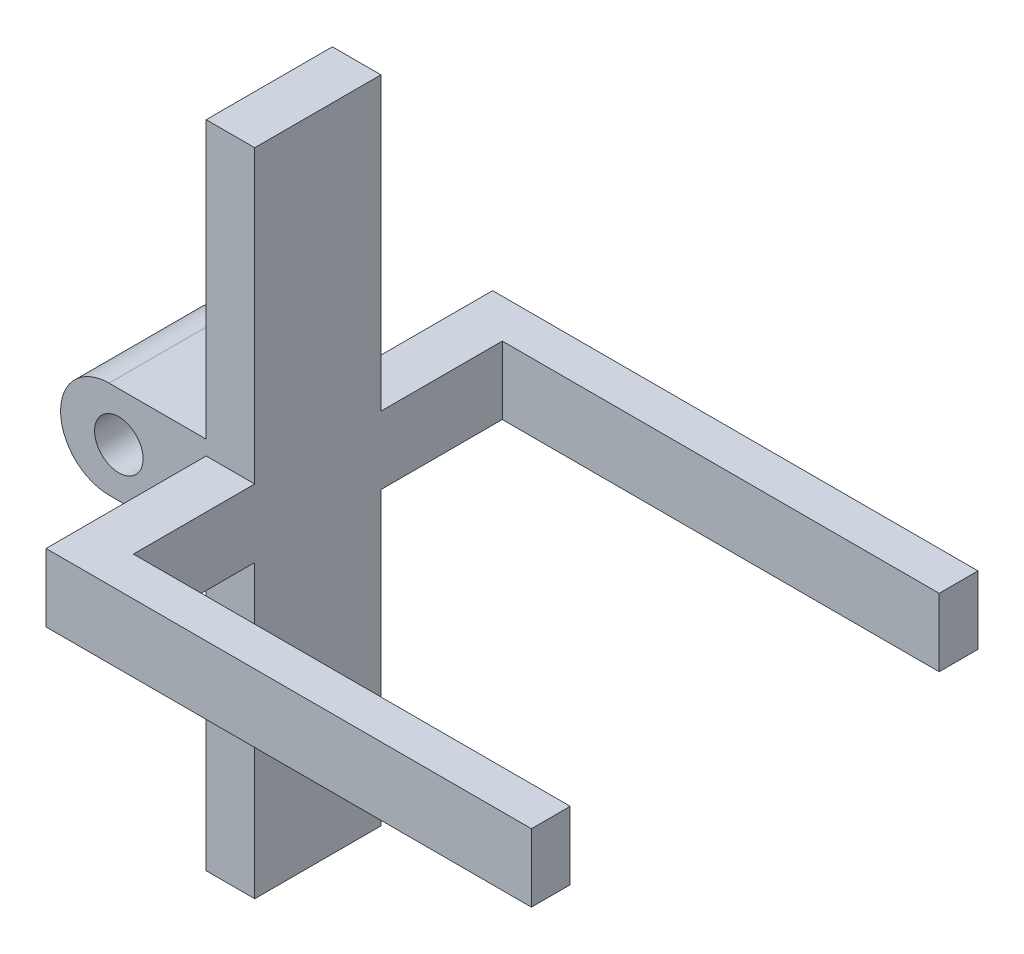
ISO-10303-21;
HEADER;
FILE_DESCRIPTION(('STEP AP214'),'2;1');
FILE_NAME('part.step','',(''),(''),'','','');
FILE_SCHEMA(('AUTOMOTIVE_DESIGN { 1 0 10303 214 1 1 1 1 }'));
ENDSEC;
DATA;
#1=APPLICATION_CONTEXT('core data for automotive mechanical design processes');
#2=APPLICATION_PROTOCOL_DEFINITION('international standard','automotive_design',2000,#1);
#3=PRODUCT_CONTEXT('',#1,'mechanical');
#4=PRODUCT('Part','Part','',(#3));
#5=PRODUCT_RELATED_PRODUCT_CATEGORY('part','',(#4));
#6=PRODUCT_DEFINITION_FORMATION('','',#4);
#7=PRODUCT_DEFINITION_CONTEXT('part definition',#1,'design');
#8=PRODUCT_DEFINITION('design','',#6,#7);
#9=PRODUCT_DEFINITION_SHAPE('','',#8);
#10=(LENGTH_UNIT() NAMED_UNIT(*) SI_UNIT(.MILLI.,.METRE.));
#11=(NAMED_UNIT(*) PLANE_ANGLE_UNIT() SI_UNIT($,.RADIAN.));
#12=(NAMED_UNIT(*) SI_UNIT($,.STERADIAN.) SOLID_ANGLE_UNIT());
#13=UNCERTAINTY_MEASURE_WITH_UNIT(LENGTH_MEASURE(1.E-05),#10,'distance_accuracy_value','');
#14=(GEOMETRIC_REPRESENTATION_CONTEXT(3) GLOBAL_UNCERTAINTY_ASSIGNED_CONTEXT((#13)) GLOBAL_UNIT_ASSIGNED_CONTEXT((#10,
#11,#12)) REPRESENTATION_CONTEXT('',''));
#15=CARTESIAN_POINT('',(0.,0.,0.));
#16=DIRECTION('',(0.,0.,1.));
#17=DIRECTION('',(1.,0.,0.));
#18=AXIS2_PLACEMENT_3D('',#15,#16,#17);
#19=CARTESIAN_POINT('',(12.5,-3.5,23.));
#20=DIRECTION('',(0.,1.,0.));
#21=DIRECTION('',(0.,0.,1.));
#22=AXIS2_PLACEMENT_3D('',#19,#20,#21);
#23=PLANE('',#22);
#24=DIRECTION('',(0.,0.,-1.));
#25=VECTOR('',#24,1.);
#26=CARTESIAN_POINT('',(12.5,-3.5,23.));
#27=LINE('',#26,#25);
#28=CARTESIAN_POINT('',(12.5,-3.5,-6.5));
#29=VERTEX_POINT('',#28);
#30=CARTESIAN_POINT('',(12.5,-3.5,-19.));
#31=VERTEX_POINT('',#30);
#32=EDGE_CURVE('E325',#29,#31,#27,.T.);
#33=ORIENTED_EDGE('',*,*,#32,.F.);
#34=DIRECTION('',(-1.,0.,0.));
#35=VECTOR('',#34,1.);
#36=CARTESIAN_POINT('',(7.5,-3.5,-6.5));
#37=LINE('',#36,#35);
#38=CARTESIAN_POINT('',(7.5,-3.5,-6.5));
#39=VERTEX_POINT('',#38);
#40=EDGE_CURVE('E223',#29,#39,#37,.T.);
#41=ORIENTED_EDGE('',*,*,#40,.T.);
#42=DIRECTION('',(0.,0.,-1.));
#43=VECTOR('',#42,1.);
#44=CARTESIAN_POINT('',(7.5,-3.5,23.));
#45=LINE('',#44,#43);
#46=CARTESIAN_POINT('',(7.5,-3.5,-23.));
#47=VERTEX_POINT('',#46);
#48=EDGE_CURVE('E341',#39,#47,#45,.T.);
#49=ORIENTED_EDGE('',*,*,#48,.T.);
#50=DIRECTION('',(-1.,0.,0.));
#51=VECTOR('',#50,1.);
#52=CARTESIAN_POINT('',(12.5,-3.5,-23.));
#53=LINE('',#52,#51);
#54=CARTESIAN_POINT('',(57.5,-3.5,-23.));
#55=VERTEX_POINT('',#54);
#56=EDGE_CURVE('E330',#55,#47,#53,.T.);
#57=ORIENTED_EDGE('',*,*,#56,.F.);
#58=DIRECTION('',(0.,0.,-1.));
#59=VECTOR('',#58,1.);
#60=CARTESIAN_POINT('',(57.5,-3.5,-23.));
#61=LINE('',#60,#59);
#62=CARTESIAN_POINT('',(57.5,-3.5,-19.));
#63=VERTEX_POINT('',#62);
#64=EDGE_CURVE('E277',#63,#55,#61,.T.);
#65=ORIENTED_EDGE('',*,*,#64,.F.);
#66=DIRECTION('',(-1.,0.,0.));
#67=VECTOR('',#66,1.);
#68=CARTESIAN_POINT('',(57.5,-3.5,-19.));
#69=LINE('',#68,#67);
#70=EDGE_CURVE('E273',#63,#31,#69,.T.);
#71=ORIENTED_EDGE('',*,*,#70,.T.);
#72=EDGE_LOOP('',(#33,#41,#49,#57,#65,#71));
#73=FACE_BOUND('',#72,.T.);
#74=ADVANCED_FACE('F43',(#73),#23,.F.);
#75=CARTESIAN_POINT('',(12.5,3.5,23.));
#76=DIRECTION('',(0.,-1.,0.));
#77=DIRECTION('',(0.,0.,-1.));
#78=AXIS2_PLACEMENT_3D('',#75,#76,#77);
#79=PLANE('',#78);
#80=DIRECTION('',(1.,0.,0.));
#81=VECTOR('',#80,1.);
#82=CARTESIAN_POINT('',(7.5,3.5,6.5));
#83=LINE('',#82,#81);
#84=CARTESIAN_POINT('',(7.5,3.5,6.5));
#85=VERTEX_POINT('',#84);
#86=CARTESIAN_POINT('',(12.5,3.5,6.5));
#87=VERTEX_POINT('',#86);
#88=EDGE_CURVE('E199',#85,#87,#83,.T.);
#89=ORIENTED_EDGE('',*,*,#88,.F.);
#90=DIRECTION('',(0.,0.,1.));
#91=VECTOR('',#90,1.);
#92=CARTESIAN_POINT('',(7.5,3.5,23.));
#93=LINE('',#92,#91);
#94=CARTESIAN_POINT('',(7.5,3.5,23.));
#95=VERTEX_POINT('',#94);
#96=EDGE_CURVE('E334',#85,#95,#93,.T.);
#97=ORIENTED_EDGE('',*,*,#96,.T.);
#98=DIRECTION('',(-1.,0.,0.));
#99=VECTOR('',#98,1.);
#100=CARTESIAN_POINT('',(12.5,3.5,23.));
#101=LINE('',#100,#99);
#102=CARTESIAN_POINT('',(57.5,3.5,23.));
#103=VERTEX_POINT('',#102);
#104=EDGE_CURVE('E353',#103,#95,#101,.T.);
#105=ORIENTED_EDGE('',*,*,#104,.F.);
#106=DIRECTION('',(0.,0.,1.));
#107=VECTOR('',#106,1.);
#108=CARTESIAN_POINT('',(57.5,3.5,23.));
#109=LINE('',#108,#107);
#110=CARTESIAN_POINT('',(57.5,3.5,19.));
#111=VERTEX_POINT('',#110);
#112=EDGE_CURVE('E306',#111,#103,#109,.T.);
#113=ORIENTED_EDGE('',*,*,#112,.F.);
#114=DIRECTION('',(-1.,0.,0.));
#115=VECTOR('',#114,1.);
#116=CARTESIAN_POINT('',(57.5,3.5,19.));
#117=LINE('',#116,#115);
#118=CARTESIAN_POINT('',(12.5,3.5,19.));
#119=VERTEX_POINT('',#118);
#120=EDGE_CURVE('E310',#111,#119,#117,.T.);
#121=ORIENTED_EDGE('',*,*,#120,.T.);
#122=DIRECTION('',(0.,0.,1.));
#123=VECTOR('',#122,1.);
#124=CARTESIAN_POINT('',(12.5,3.5,23.));
#125=LINE('',#124,#123);
#126=EDGE_CURVE('E68',#87,#119,#125,.T.);
#127=ORIENTED_EDGE('',*,*,#126,.F.);
#128=EDGE_LOOP('',(#89,#97,#105,#113,#121,#127));
#129=FACE_BOUND('',#128,.T.);
#130=ADVANCED_FACE('F469',(#129),#79,.F.);
#131=DIRECTION('',(-1.,0.,0.));
#132=VECTOR('',#131,1.);
#133=CARTESIAN_POINT('',(7.5,3.5,-6.5));
#134=LINE('',#133,#132);
#135=CARTESIAN_POINT('',(12.5,3.5,-6.5));
#136=VERTEX_POINT('',#135);
#137=CARTESIAN_POINT('',(7.5,3.5,-6.5));
#138=VERTEX_POINT('',#137);
#139=EDGE_CURVE('E239',#136,#138,#134,.T.);
#140=ORIENTED_EDGE('',*,*,#139,.F.);
#141=CARTESIAN_POINT('',(12.5,3.5,-19.));
#142=VERTEX_POINT('',#141);
#143=EDGE_CURVE('E321',#142,#136,#125,.T.);
#144=ORIENTED_EDGE('',*,*,#143,.F.);
#145=DIRECTION('',(-1.,0.,0.));
#146=VECTOR('',#145,1.);
#147=CARTESIAN_POINT('',(57.5,3.5,-19.));
#148=LINE('',#147,#146);
#149=CARTESIAN_POINT('',(57.5,3.5,-19.));
#150=VERTEX_POINT('',#149);
#151=EDGE_CURVE('E269',#150,#142,#148,.T.);
#152=ORIENTED_EDGE('',*,*,#151,.F.);
#153=DIRECTION('',(0.,0.,1.));
#154=VECTOR('',#153,1.);
#155=CARTESIAN_POINT('',(57.5,3.5,-23.));
#156=LINE('',#155,#154);
#157=CARTESIAN_POINT('',(57.5,3.5,-23.));
#158=VERTEX_POINT('',#157);
#159=EDGE_CURVE('E290',#158,#150,#156,.T.);
#160=ORIENTED_EDGE('',*,*,#159,.F.);
#161=DIRECTION('',(-1.,0.,0.));
#162=VECTOR('',#161,1.);
#163=CARTESIAN_POINT('',(12.5,3.5,-23.));
#164=LINE('',#163,#162);
#165=CARTESIAN_POINT('',(7.5,3.5,-23.));
#166=VERTEX_POINT('',#165);
#167=EDGE_CURVE('E357',#158,#166,#164,.T.);
#168=ORIENTED_EDGE('',*,*,#167,.T.);
#169=EDGE_CURVE('E335',#166,#138,#93,.T.);
#170=ORIENTED_EDGE('',*,*,#169,.T.);
#171=EDGE_LOOP('',(#140,#144,#152,#160,#168,#170));
#172=FACE_BOUND('',#171,.T.);
#173=ADVANCED_FACE('F445',(#172),#79,.F.);
#174=CARTESIAN_POINT('',(12.5,0.,0.));
#175=DIRECTION('',(-1.,0.,0.));
#176=DIRECTION('',(0.,0.,1.));
#177=AXIS2_PLACEMENT_3D('',#174,#175,#176);
#178=PLANE('',#177);
#179=DIRECTION('',(0.,-1.,0.));
#180=VECTOR('',#179,1.);
#181=CARTESIAN_POINT('',(12.5,3.5,-19.));
#182=LINE('',#181,#180);
#183=EDGE_CURVE('E278',#142,#31,#182,.T.);
#184=ORIENTED_EDGE('',*,*,#183,.F.);
#185=ORIENTED_EDGE('',*,*,#143,.T.);
#186=DIRECTION('',(0.,-1.,0.));
#187=VECTOR('',#186,1.);
#188=CARTESIAN_POINT('',(12.5,33.5,-6.5));
#189=LINE('',#188,#187);
#190=CARTESIAN_POINT('',(12.5,33.5,-6.5));
#191=VERTEX_POINT('',#190);
#192=EDGE_CURVE('E257',#191,#136,#189,.T.);
#193=ORIENTED_EDGE('',*,*,#192,.F.);
#194=DIRECTION('',(0.,0.,-1.));
#195=VECTOR('',#194,1.);
#196=CARTESIAN_POINT('',(12.5,33.5,-6.5));
#197=LINE('',#196,#195);
#198=CARTESIAN_POINT('',(12.5,33.5,6.5));
#199=VERTEX_POINT('',#198);
#200=EDGE_CURVE('E242',#199,#191,#197,.T.);
#201=ORIENTED_EDGE('',*,*,#200,.F.);
#202=DIRECTION('',(0.,-1.,0.));
#203=VECTOR('',#202,1.);
#204=CARTESIAN_POINT('',(12.5,33.5,6.5));
#205=LINE('',#204,#203);
#206=EDGE_CURVE('E261',#199,#87,#205,.T.);
#207=ORIENTED_EDGE('',*,*,#206,.T.);
#208=ORIENTED_EDGE('',*,*,#126,.T.);
#209=DIRECTION('',(0.,1.,0.));
#210=VECTOR('',#209,1.);
#211=CARTESIAN_POINT('',(12.5,3.5,19.));
#212=LINE('',#211,#210);
#213=CARTESIAN_POINT('',(12.5,-3.5,19.));
#214=VERTEX_POINT('',#213);
#215=EDGE_CURVE('E282',#214,#119,#212,.T.);
#216=ORIENTED_EDGE('',*,*,#215,.F.);
#217=CARTESIAN_POINT('',(12.5,-3.5,6.5));
#218=VERTEX_POINT('',#217);
#219=EDGE_CURVE('E326',#214,#218,#27,.T.);
#220=ORIENTED_EDGE('',*,*,#219,.T.);
#221=DIRECTION('',(0.,1.,0.));
#222=VECTOR('',#221,1.);
#223=CARTESIAN_POINT('',(12.5,-33.5,6.5));
#224=LINE('',#223,#222);
#225=CARTESIAN_POINT('',(12.5,-33.5,6.5));
#226=VERTEX_POINT('',#225);
#227=EDGE_CURVE('E60',#226,#218,#224,.T.);
#228=ORIENTED_EDGE('',*,*,#227,.F.);
#229=DIRECTION('',(0.,0.,-1.));
#230=VECTOR('',#229,1.);
#231=CARTESIAN_POINT('',(12.5,-33.5,-6.5));
#232=LINE('',#231,#230);
#233=CARTESIAN_POINT('',(12.5,-33.5,-6.5));
#234=VERTEX_POINT('',#233);
#235=EDGE_CURVE('E215',#226,#234,#232,.T.);
#236=ORIENTED_EDGE('',*,*,#235,.T.);
#237=DIRECTION('',(0.,1.,0.));
#238=VECTOR('',#237,1.);
#239=CARTESIAN_POINT('',(12.5,-33.5,-6.5));
#240=LINE('',#239,#238);
#241=EDGE_CURVE('E200',#234,#29,#240,.T.);
#242=ORIENTED_EDGE('',*,*,#241,.T.);
#243=ORIENTED_EDGE('',*,*,#32,.T.);
#244=EDGE_LOOP('',(#184,#185,#193,#201,#207,#208,#216,#220,#228,#236,#242,#243));
#245=FACE_BOUND('',#244,.T.);
#246=ADVANCED_FACE('F441',(#245),#178,.F.);
#247=CARTESIAN_POINT('',(7.5,-5.,-6.5));
#248=DIRECTION('',(0.,0.,1.));
#249=DIRECTION('',(1.,0.,0.));
#250=AXIS2_PLACEMENT_3D('',#247,#248,#249);
#251=PLANE('',#250);
#252=CARTESIAN_POINT('',(-1.5,0.,-6.5));
#253=DIRECTION('',(0.,0.,1.));
#254=DIRECTION('',(1.,0.,0.));
#255=AXIS2_PLACEMENT_3D('',#252,#253,#254);
#256=CIRCLE('',#255,2.5);
#257=CARTESIAN_POINT('',(1.,0.,-6.5));
#258=VERTEX_POINT('',#257);
#259=EDGE_CURVE('E365',#258,#258,#256,.T.);
#260=ORIENTED_EDGE('',*,*,#259,.T.);
#261=EDGE_LOOP('',(#260));
#262=FACE_BOUND('',#261,.T.);
#263=DIRECTION('',(-1.,0.,0.));
#264=VECTOR('',#263,1.);
#265=CARTESIAN_POINT('',(7.5,-5.,-6.5));
#266=LINE('',#265,#264);
#267=CARTESIAN_POINT('',(7.5,-5.,-6.5));
#268=VERTEX_POINT('',#267);
#269=CARTESIAN_POINT('',(-2.5,-5.,-6.5));
#270=VERTEX_POINT('',#269);
#271=EDGE_CURVE('E383',#268,#270,#266,.T.);
#272=ORIENTED_EDGE('',*,*,#271,.T.);
#273=CARTESIAN_POINT('',(-2.5,0.,-6.5));
#274=DIRECTION('',(0.,0.,1.));
#275=DIRECTION('',(1.,0.,0.));
#276=AXIS2_PLACEMENT_3D('',#273,#274,#275);
#277=CIRCLE('',#276,5.);
#278=CARTESIAN_POINT('',(-7.5,0.,-6.5));
#279=VERTEX_POINT('',#278);
#280=EDGE_CURVE('E405',#270,#279,#277,.F.);
#281=ORIENTED_EDGE('',*,*,#280,.T.);
#282=CARTESIAN_POINT('',(-2.5,0.,-6.5));
#283=DIRECTION('',(0.,0.,1.));
#284=DIRECTION('',(1.,0.,0.));
#285=AXIS2_PLACEMENT_3D('',#282,#283,#284);
#286=CIRCLE('',#285,5.);
#287=CARTESIAN_POINT('',(-2.5,5.,-6.5));
#288=VERTEX_POINT('',#287);
#289=EDGE_CURVE('E402',#279,#288,#286,.F.);
#290=ORIENTED_EDGE('',*,*,#289,.T.);
#291=DIRECTION('',(-1.,0.,0.));
#292=VECTOR('',#291,1.);
#293=CARTESIAN_POINT('',(7.5,5.,-6.5));
#294=LINE('',#293,#292);
#295=CARTESIAN_POINT('',(7.5,5.,-6.5));
#296=VERTEX_POINT('',#295);
#297=EDGE_CURVE('E394',#296,#288,#294,.T.);
#298=ORIENTED_EDGE('',*,*,#297,.F.);
#299=DIRECTION('',(0.,-1.,0.));
#300=VECTOR('',#299,1.);
#301=CARTESIAN_POINT('',(7.5,33.5,-6.5));
#302=LINE('',#301,#300);
#303=CARTESIAN_POINT('',(7.5,33.5,-6.5));
#304=VERTEX_POINT('',#303);
#305=EDGE_CURVE('E248',#304,#296,#302,.T.);
#306=ORIENTED_EDGE('',*,*,#305,.F.);
#307=DIRECTION('',(-1.,0.,0.));
#308=VECTOR('',#307,1.);
#309=CARTESIAN_POINT('',(7.5,33.5,-6.5));
#310=LINE('',#309,#308);
#311=EDGE_CURVE('E245',#191,#304,#310,.T.);
#312=ORIENTED_EDGE('',*,*,#311,.F.);
#313=ORIENTED_EDGE('',*,*,#192,.T.);
#314=ORIENTED_EDGE('',*,*,#139,.T.);
#315=DIRECTION('',(0.,1.,0.));
#316=VECTOR('',#315,1.);
#317=CARTESIAN_POINT('',(7.5,-5.,-6.5));
#318=LINE('',#317,#316);
#319=EDGE_CURVE('E369',#39,#138,#318,.T.);
#320=ORIENTED_EDGE('',*,*,#319,.F.);
#321=ORIENTED_EDGE('',*,*,#40,.F.);
#322=ORIENTED_EDGE('',*,*,#241,.F.);
#323=DIRECTION('',(-1.,0.,0.));
#324=VECTOR('',#323,1.);
#325=CARTESIAN_POINT('',(7.5,-33.5,-6.5));
#326=LINE('',#325,#324);
#327=CARTESIAN_POINT('',(7.5,-33.5,-6.5));
#328=VERTEX_POINT('',#327);
#329=EDGE_CURVE('E206',#234,#328,#326,.T.);
#330=ORIENTED_EDGE('',*,*,#329,.T.);
#331=DIRECTION('',(0.,1.,0.));
#332=VECTOR('',#331,1.);
#333=CARTESIAN_POINT('',(7.5,-33.5,-6.5));
#334=LINE('',#333,#332);
#335=EDGE_CURVE('E187',#328,#268,#334,.T.);
#336=ORIENTED_EDGE('',*,*,#335,.T.);
#337=EDGE_LOOP('',(#272,#281,#290,#298,#306,#312,#313,#314,#320,#321,#322,#330,#336));
#338=FACE_BOUND('',#337,.T.);
#339=ADVANCED_FACE('F212',(#262,#338),#251,.F.);
#340=CARTESIAN_POINT('',(7.5,5.,6.5));
#341=DIRECTION('',(0.,-1.,0.));
#342=DIRECTION('',(0.,0.,-1.));
#343=AXIS2_PLACEMENT_3D('',#340,#341,#342);
#344=PLANE('',#343);
#345=ORIENTED_EDGE('',*,*,#297,.T.);
#346=DIRECTION('',(0.,0.,1.));
#347=VECTOR('',#346,1.);
#348=CARTESIAN_POINT('',(-2.5,5.,6.5));
#349=LINE('',#348,#347);
#350=CARTESIAN_POINT('',(-2.5,5.,6.5));
#351=VERTEX_POINT('',#350);
#352=EDGE_CURVE('E11',#288,#351,#349,.T.);
#353=ORIENTED_EDGE('',*,*,#352,.T.);
#354=DIRECTION('',(-1.,0.,0.));
#355=VECTOR('',#354,1.);
#356=CARTESIAN_POINT('',(7.5,5.,6.5));
#357=LINE('',#356,#355);
#358=CARTESIAN_POINT('',(7.5,5.,6.5));
#359=VERTEX_POINT('',#358);
#360=EDGE_CURVE('E390',#359,#351,#357,.T.);
#361=ORIENTED_EDGE('',*,*,#360,.F.);
#362=DIRECTION('',(0.,0.,1.));
#363=VECTOR('',#362,1.);
#364=CARTESIAN_POINT('',(7.5,5.,6.5));
#365=LINE('',#364,#363);
#366=EDGE_CURVE('E373',#296,#359,#365,.T.);
#367=ORIENTED_EDGE('',*,*,#366,.F.);
#368=EDGE_LOOP('',(#345,#353,#361,#367));
#369=FACE_BOUND('',#368,.T.);
#370=ADVANCED_FACE('F428',(#369),#344,.F.);
#371=CARTESIAN_POINT('',(7.5,-5.,6.5));
#372=DIRECTION('',(0.,0.,-1.));
#373=DIRECTION('',(-1.,0.,0.));
#374=AXIS2_PLACEMENT_3D('',#371,#372,#373);
#375=PLANE('',#374);
#376=CARTESIAN_POINT('',(-1.5,0.,6.5));
#377=DIRECTION('',(0.,0.,1.));
#378=DIRECTION('',(1.,0.,0.));
#379=AXIS2_PLACEMENT_3D('',#376,#377,#378);
#380=CIRCLE('',#379,2.5);
#381=CARTESIAN_POINT('',(1.,0.,6.5));
#382=VERTEX_POINT('',#381);
#383=EDGE_CURVE('E361',#382,#382,#380,.T.);
#384=ORIENTED_EDGE('',*,*,#383,.F.);
#385=EDGE_LOOP('',(#384));
#386=FACE_BOUND('',#385,.T.);
#387=CARTESIAN_POINT('',(-2.5,0.,6.5));
#388=DIRECTION('',(0.,0.,-1.));
#389=DIRECTION('',(-1.,0.,0.));
#390=AXIS2_PLACEMENT_3D('',#387,#388,#389);
#391=CIRCLE('',#390,5.);
#392=CARTESIAN_POINT('',(-7.5,0.,6.5));
#393=VERTEX_POINT('',#392);
#394=EDGE_CURVE('E408',#351,#393,#391,.F.);
#395=ORIENTED_EDGE('',*,*,#394,.T.);
#396=CARTESIAN_POINT('',(-2.5,0.,6.5));
#397=DIRECTION('',(0.,0.,-1.));
#398=DIRECTION('',(-1.,0.,0.));
#399=AXIS2_PLACEMENT_3D('',#396,#397,#398);
#400=CIRCLE('',#399,5.);
#401=CARTESIAN_POINT('',(-2.5,-5.,6.5));
#402=VERTEX_POINT('',#401);
#403=EDGE_CURVE('E53',#393,#402,#400,.F.);
#404=ORIENTED_EDGE('',*,*,#403,.T.);
#405=DIRECTION('',(-1.,0.,0.));
#406=VECTOR('',#405,1.);
#407=CARTESIAN_POINT('',(7.5,-5.,6.5));
#408=LINE('',#407,#406);
#409=CARTESIAN_POINT('',(7.5,-5.,6.5));
#410=VERTEX_POINT('',#409);
#411=EDGE_CURVE('E386',#410,#402,#408,.T.);
#412=ORIENTED_EDGE('',*,*,#411,.F.);
#413=DIRECTION('',(0.,1.,0.));
#414=VECTOR('',#413,1.);
#415=CARTESIAN_POINT('',(7.5,-33.5,6.5));
#416=LINE('',#415,#414);
#417=CARTESIAN_POINT('',(7.5,-33.5,6.5));
#418=VERTEX_POINT('',#417);
#419=EDGE_CURVE('E222',#418,#410,#416,.T.);
#420=ORIENTED_EDGE('',*,*,#419,.F.);
#421=DIRECTION('',(1.,0.,0.));
#422=VECTOR('',#421,1.);
#423=CARTESIAN_POINT('',(7.5,-33.5,6.5));
#424=LINE('',#423,#422);
#425=EDGE_CURVE('E208',#418,#226,#424,.T.);
#426=ORIENTED_EDGE('',*,*,#425,.T.);
#427=ORIENTED_EDGE('',*,*,#227,.T.);
#428=DIRECTION('',(1.,0.,0.));
#429=VECTOR('',#428,1.);
#430=CARTESIAN_POINT('',(7.5,-3.5,6.5));
#431=LINE('',#430,#429);
#432=CARTESIAN_POINT('',(7.5,-3.5,6.5));
#433=VERTEX_POINT('',#432);
#434=EDGE_CURVE('E210',#433,#218,#431,.T.);
#435=ORIENTED_EDGE('',*,*,#434,.F.);
#436=DIRECTION('',(0.,-1.,0.));
#437=VECTOR('',#436,1.);
#438=CARTESIAN_POINT('',(7.5,-5.,6.5));
#439=LINE('',#438,#437);
#440=EDGE_CURVE('E377',#85,#433,#439,.T.);
#441=ORIENTED_EDGE('',*,*,#440,.F.);
#442=ORIENTED_EDGE('',*,*,#88,.T.);
#443=ORIENTED_EDGE('',*,*,#206,.F.);
#444=DIRECTION('',(1.,0.,0.));
#445=VECTOR('',#444,1.);
#446=CARTESIAN_POINT('',(7.5,33.5,6.5));
#447=LINE('',#446,#445);
#448=CARTESIAN_POINT('',(7.5,33.5,6.5));
#449=VERTEX_POINT('',#448);
#450=EDGE_CURVE('E238',#449,#199,#447,.T.);
#451=ORIENTED_EDGE('',*,*,#450,.F.);
#452=DIRECTION('',(0.,-1.,0.));
#453=VECTOR('',#452,1.);
#454=CARTESIAN_POINT('',(7.5,33.5,6.5));
#455=LINE('',#454,#453);
#456=EDGE_CURVE('E265',#449,#359,#455,.T.);
#457=ORIENTED_EDGE('',*,*,#456,.T.);
#458=ORIENTED_EDGE('',*,*,#360,.T.);
#459=EDGE_LOOP('',(#395,#404,#412,#420,#426,#427,#435,#441,#442,#443,#451,#457,#458));
#460=FACE_BOUND('',#459,.T.);
#461=ADVANCED_FACE('F414',(#386,#460),#375,.F.);
#462=CARTESIAN_POINT('',(7.5,-5.,6.5));
#463=DIRECTION('',(0.,1.,0.));
#464=DIRECTION('',(0.,0.,1.));
#465=AXIS2_PLACEMENT_3D('',#462,#463,#464);
#466=PLANE('',#465);
#467=ORIENTED_EDGE('',*,*,#411,.T.);
#468=DIRECTION('',(0.,0.,-1.));
#469=VECTOR('',#468,1.);
#470=CARTESIAN_POINT('',(-2.5,-5.,-6.5));
#471=LINE('',#470,#469);
#472=EDGE_CURVE('E398',#402,#270,#471,.T.);
#473=ORIENTED_EDGE('',*,*,#472,.T.);
#474=ORIENTED_EDGE('',*,*,#271,.F.);
#475=DIRECTION('',(0.,0.,-1.));
#476=VECTOR('',#475,1.);
#477=CARTESIAN_POINT('',(7.5,-5.,6.5));
#478=LINE('',#477,#476);
#479=EDGE_CURVE('E193',#410,#268,#478,.T.);
#480=ORIENTED_EDGE('',*,*,#479,.F.);
#481=EDGE_LOOP('',(#467,#473,#474,#480));
#482=FACE_BOUND('',#481,.T.);
#483=ADVANCED_FACE('F421',(#482),#466,.F.);
#484=CARTESIAN_POINT('',(-1.5,0.,-8.5));
#485=DIRECTION('',(0.,0.,1.));
#486=DIRECTION('',(1.,0.,0.));
#487=AXIS2_PLACEMENT_3D('',#484,#485,#486);
#488=CYLINDRICAL_SURFACE('',#487,2.5);
#489=ORIENTED_EDGE('',*,*,#383,.T.);
#490=EDGE_LOOP('',(#489));
#491=FACE_BOUND('',#490,.T.);
#492=ORIENTED_EDGE('',*,*,#259,.F.);
#493=EDGE_LOOP('',(#492));
#494=FACE_BOUND('',#493,.T.);
#495=ADVANCED_FACE('F515',(#491,#494),#488,.F.);
#496=CARTESIAN_POINT('',(-2.5,0.,6.5));
#497=DIRECTION('',(0.,0.,-1.));
#498=DIRECTION('',(-1.,0.,0.));
#499=AXIS2_PLACEMENT_3D('',#496,#497,#498);
#500=CYLINDRICAL_SURFACE('',#499,5.);
#501=DIRECTION('',(0.,0.,1.));
#502=VECTOR('',#501,1.);
#503=CARTESIAN_POINT('',(-7.5,0.,-6.5));
#504=LINE('',#503,#502);
#505=EDGE_CURVE('E47',#393,#279,#504,.F.);
#506=ORIENTED_EDGE('',*,*,#505,.F.);
#507=ORIENTED_EDGE('',*,*,#394,.F.);
#508=ORIENTED_EDGE('',*,*,#352,.F.);
#509=ORIENTED_EDGE('',*,*,#289,.F.);
#510=EDGE_LOOP('',(#506,#507,#508,#509));
#511=FACE_BOUND('',#510,.T.);
#512=ADVANCED_FACE('F45',(#511),#500,.T.);
#513=CARTESIAN_POINT('',(-2.5,0.,6.5));
#514=DIRECTION('',(0.,0.,1.));
#515=DIRECTION('',(1.,0.,0.));
#516=AXIS2_PLACEMENT_3D('',#513,#514,#515);
#517=CYLINDRICAL_SURFACE('',#516,5.);
#518=ORIENTED_EDGE('',*,*,#403,.F.);
#519=ORIENTED_EDGE('',*,*,#505,.T.);
#520=ORIENTED_EDGE('',*,*,#280,.F.);
#521=ORIENTED_EDGE('',*,*,#472,.F.);
#522=EDGE_LOOP('',(#518,#519,#520,#521));
#523=FACE_BOUND('',#522,.T.);
#524=ADVANCED_FACE('F422',(#523),#517,.T.);
#525=CARTESIAN_POINT('',(7.5,0.,0.));
#526=DIRECTION('',(-1.,0.,0.));
#527=DIRECTION('',(0.,0.,1.));
#528=AXIS2_PLACEMENT_3D('',#525,#526,#527);
#529=PLANE('',#528);
#530=ORIENTED_EDGE('',*,*,#48,.F.);
#531=ORIENTED_EDGE('',*,*,#319,.T.);
#532=ORIENTED_EDGE('',*,*,#169,.F.);
#533=DIRECTION('',(0.,1.,0.));
#534=VECTOR('',#533,1.);
#535=CARTESIAN_POINT('',(7.5,-3.5,-23.));
#536=LINE('',#535,#534);
#537=EDGE_CURVE('E320',#47,#166,#536,.T.);
#538=ORIENTED_EDGE('',*,*,#537,.F.);
#539=EDGE_LOOP('',(#530,#531,#532,#538));
#540=FACE_BOUND('',#539,.T.);
#541=ADVANCED_FACE('F460',(#540),#529,.T.);
#542=CARTESIAN_POINT('',(12.5,-3.5,-23.));
#543=DIRECTION('',(0.,0.,1.));
#544=DIRECTION('',(1.,0.,0.));
#545=AXIS2_PLACEMENT_3D('',#542,#543,#544);
#546=PLANE('',#545);
#547=ORIENTED_EDGE('',*,*,#537,.T.);
#548=ORIENTED_EDGE('',*,*,#167,.F.);
#549=DIRECTION('',(0.,1.,0.));
#550=VECTOR('',#549,1.);
#551=CARTESIAN_POINT('',(57.5,3.5,-23.));
#552=LINE('',#551,#550);
#553=EDGE_CURVE('E283',#55,#158,#552,.T.);
#554=ORIENTED_EDGE('',*,*,#553,.F.);
#555=ORIENTED_EDGE('',*,*,#56,.T.);
#556=EDGE_LOOP('',(#547,#548,#554,#555));
#557=FACE_BOUND('',#556,.T.);
#558=ADVANCED_FACE('F457',(#557),#546,.F.);
#559=CARTESIAN_POINT('',(12.5,-3.5,23.));
#560=DIRECTION('',(0.,0.,-1.));
#561=DIRECTION('',(-1.,0.,0.));
#562=AXIS2_PLACEMENT_3D('',#559,#560,#561);
#563=PLANE('',#562);
#564=DIRECTION('',(0.,-1.,0.));
#565=VECTOR('',#564,1.);
#566=CARTESIAN_POINT('',(7.5,-3.5,23.));
#567=LINE('',#566,#565);
#568=CARTESIAN_POINT('',(7.5,-3.5,23.));
#569=VERTEX_POINT('',#568);
#570=EDGE_CURVE('E338',#95,#569,#567,.T.);
#571=ORIENTED_EDGE('',*,*,#570,.T.);
#572=DIRECTION('',(-1.,0.,0.));
#573=VECTOR('',#572,1.);
#574=CARTESIAN_POINT('',(12.5,-3.5,23.));
#575=LINE('',#574,#573);
#576=CARTESIAN_POINT('',(57.5,-3.5,23.));
#577=VERTEX_POINT('',#576);
#578=EDGE_CURVE('E349',#577,#569,#575,.T.);
#579=ORIENTED_EDGE('',*,*,#578,.F.);
#580=DIRECTION('',(0.,-1.,0.));
#581=VECTOR('',#580,1.);
#582=CARTESIAN_POINT('',(57.5,3.5,23.));
#583=LINE('',#582,#581);
#584=EDGE_CURVE('E296',#103,#577,#583,.T.);
#585=ORIENTED_EDGE('',*,*,#584,.F.);
#586=ORIENTED_EDGE('',*,*,#104,.T.);
#587=EDGE_LOOP('',(#571,#579,#585,#586));
#588=FACE_BOUND('',#587,.T.);
#589=ADVANCED_FACE('F476',(#588),#563,.F.);
#590=EDGE_CURVE('E342',#569,#433,#45,.T.);
#591=ORIENTED_EDGE('',*,*,#590,.T.);
#592=ORIENTED_EDGE('',*,*,#434,.T.);
#593=ORIENTED_EDGE('',*,*,#219,.F.);
#594=DIRECTION('',(-1.,0.,0.));
#595=VECTOR('',#594,1.);
#596=CARTESIAN_POINT('',(57.5,-3.5,19.));
#597=LINE('',#596,#595);
#598=CARTESIAN_POINT('',(57.5,-3.5,19.));
#599=VERTEX_POINT('',#598);
#600=EDGE_CURVE('E316',#599,#214,#597,.T.);
#601=ORIENTED_EDGE('',*,*,#600,.F.);
#602=DIRECTION('',(0.,0.,-1.));
#603=VECTOR('',#602,1.);
#604=CARTESIAN_POINT('',(57.5,-3.5,23.));
#605=LINE('',#604,#603);
#606=EDGE_CURVE('E300',#577,#599,#605,.T.);
#607=ORIENTED_EDGE('',*,*,#606,.F.);
#608=ORIENTED_EDGE('',*,*,#578,.T.);
#609=EDGE_LOOP('',(#591,#592,#593,#601,#607,#608));
#610=FACE_BOUND('',#609,.T.);
#611=ADVANCED_FACE('F480',(#610),#23,.F.);
#612=ORIENTED_EDGE('',*,*,#96,.F.);
#613=ORIENTED_EDGE('',*,*,#440,.T.);
#614=ORIENTED_EDGE('',*,*,#590,.F.);
#615=ORIENTED_EDGE('',*,*,#570,.F.);
#616=EDGE_LOOP('',(#612,#613,#614,#615));
#617=FACE_BOUND('',#616,.T.);
#618=ADVANCED_FACE('F478',(#617),#529,.T.);
#619=CARTESIAN_POINT('',(57.5,3.5,19.));
#620=DIRECTION('',(0.,0.,1.));
#621=DIRECTION('',(1.,0.,0.));
#622=AXIS2_PLACEMENT_3D('',#619,#620,#621);
#623=PLANE('',#622);
#624=ORIENTED_EDGE('',*,*,#215,.T.);
#625=ORIENTED_EDGE('',*,*,#120,.F.);
#626=DIRECTION('',(0.,1.,0.));
#627=VECTOR('',#626,1.);
#628=CARTESIAN_POINT('',(57.5,3.5,19.));
#629=LINE('',#628,#627);
#630=EDGE_CURVE('E303',#599,#111,#629,.T.);
#631=ORIENTED_EDGE('',*,*,#630,.F.);
#632=ORIENTED_EDGE('',*,*,#600,.T.);
#633=EDGE_LOOP('',(#624,#625,#631,#632));
#634=FACE_BOUND('',#633,.T.);
#635=ADVANCED_FACE('F489',(#634),#623,.F.);
#636=CARTESIAN_POINT('',(57.5,0.,0.));
#637=DIRECTION('',(1.,0.,0.));
#638=DIRECTION('',(0.,0.,-1.));
#639=AXIS2_PLACEMENT_3D('',#636,#637,#638);
#640=PLANE('',#639);
#641=ORIENTED_EDGE('',*,*,#584,.T.);
#642=ORIENTED_EDGE('',*,*,#606,.T.);
#643=ORIENTED_EDGE('',*,*,#630,.T.);
#644=ORIENTED_EDGE('',*,*,#112,.T.);
#645=EDGE_LOOP('',(#641,#642,#643,#644));
#646=FACE_BOUND('',#645,.T.);
#647=ADVANCED_FACE('F486',(#646),#640,.T.);
#648=CARTESIAN_POINT('',(57.5,3.5,-19.));
#649=DIRECTION('',(0.,0.,-1.));
#650=DIRECTION('',(-1.,0.,0.));
#651=AXIS2_PLACEMENT_3D('',#648,#649,#650);
#652=PLANE('',#651);
#653=ORIENTED_EDGE('',*,*,#183,.T.);
#654=ORIENTED_EDGE('',*,*,#70,.F.);
#655=DIRECTION('',(0.,-1.,0.));
#656=VECTOR('',#655,1.);
#657=CARTESIAN_POINT('',(57.5,3.5,-19.));
#658=LINE('',#657,#656);
#659=EDGE_CURVE('E287',#150,#63,#658,.T.);
#660=ORIENTED_EDGE('',*,*,#659,.F.);
#661=ORIENTED_EDGE('',*,*,#151,.T.);
#662=EDGE_LOOP('',(#653,#654,#660,#661));
#663=FACE_BOUND('',#662,.T.);
#664=ADVANCED_FACE('F449',(#663),#652,.F.);
#665=CARTESIAN_POINT('',(57.5,0.,0.));
#666=DIRECTION('',(-1.,0.,0.));
#667=DIRECTION('',(0.,0.,1.));
#668=AXIS2_PLACEMENT_3D('',#665,#666,#667);
#669=PLANE('',#668);
#670=ORIENTED_EDGE('',*,*,#553,.T.);
#671=ORIENTED_EDGE('',*,*,#159,.T.);
#672=ORIENTED_EDGE('',*,*,#659,.T.);
#673=ORIENTED_EDGE('',*,*,#64,.T.);
#674=EDGE_LOOP('',(#670,#671,#672,#673));
#675=FACE_BOUND('',#674,.T.);
#676=ADVANCED_FACE('F453',(#675),#669,.F.);
#677=CARTESIAN_POINT('',(7.5,33.5,-6.5));
#678=DIRECTION('',(1.,0.,0.));
#679=DIRECTION('',(0.,0.,-1.));
#680=AXIS2_PLACEMENT_3D('',#677,#678,#679);
#681=PLANE('',#680);
#682=ORIENTED_EDGE('',*,*,#305,.T.);
#683=ORIENTED_EDGE('',*,*,#366,.T.);
#684=ORIENTED_EDGE('',*,*,#456,.F.);
#685=DIRECTION('',(0.,0.,1.));
#686=VECTOR('',#685,1.);
#687=CARTESIAN_POINT('',(7.5,33.5,-6.5));
#688=LINE('',#687,#686);
#689=EDGE_CURVE('E234',#304,#449,#688,.T.);
#690=ORIENTED_EDGE('',*,*,#689,.F.);
#691=EDGE_LOOP('',(#682,#683,#684,#690));
#692=FACE_BOUND('',#691,.T.);
#693=ADVANCED_FACE('F433',(#692),#681,.F.);
#694=CARTESIAN_POINT('',(0.,33.5,0.));
#695=DIRECTION('',(0.,1.,0.));
#696=DIRECTION('',(0.,0.,1.));
#697=AXIS2_PLACEMENT_3D('',#694,#695,#696);
#698=PLANE('',#697);
#699=ORIENTED_EDGE('',*,*,#689,.T.);
#700=ORIENTED_EDGE('',*,*,#450,.T.);
#701=ORIENTED_EDGE('',*,*,#200,.T.);
#702=ORIENTED_EDGE('',*,*,#311,.T.);
#703=EDGE_LOOP('',(#699,#700,#701,#702));
#704=FACE_BOUND('',#703,.T.);
#705=ADVANCED_FACE('F438',(#704),#698,.T.);
#706=CARTESIAN_POINT('',(7.5,-33.5,-6.5));
#707=DIRECTION('',(-1.,0.,0.));
#708=DIRECTION('',(0.,0.,1.));
#709=AXIS2_PLACEMENT_3D('',#706,#707,#708);
#710=PLANE('',#709);
#711=ORIENTED_EDGE('',*,*,#479,.T.);
#712=ORIENTED_EDGE('',*,*,#335,.F.);
#713=DIRECTION('',(0.,0.,1.));
#714=VECTOR('',#713,1.);
#715=CARTESIAN_POINT('',(7.5,-33.5,-6.5));
#716=LINE('',#715,#714);
#717=EDGE_CURVE('E190',#328,#418,#716,.T.);
#718=ORIENTED_EDGE('',*,*,#717,.T.);
#719=ORIENTED_EDGE('',*,*,#419,.T.);
#720=EDGE_LOOP('',(#711,#712,#718,#719));
#721=FACE_BOUND('',#720,.T.);
#722=ADVANCED_FACE('F189',(#721),#710,.T.);
#723=CARTESIAN_POINT('',(0.,-33.5,0.));
#724=DIRECTION('',(0.,-1.,0.));
#725=DIRECTION('',(0.,0.,1.));
#726=AXIS2_PLACEMENT_3D('',#723,#724,#725);
#727=PLANE('',#726);
#728=ORIENTED_EDGE('',*,*,#717,.F.);
#729=ORIENTED_EDGE('',*,*,#329,.F.);
#730=ORIENTED_EDGE('',*,*,#235,.F.);
#731=ORIENTED_EDGE('',*,*,#425,.F.);
#732=EDGE_LOOP('',(#728,#729,#730,#731));
#733=FACE_BOUND('',#732,.T.);
#734=ADVANCED_FACE('F204',(#733),#727,.T.);
#735=CLOSED_SHELL('',(#74,#130,#173,#246,#339,#370,#461,#483,#495,#512,#524,#541,#558,#589,#611,
#618,#635,#647,#664,#676,#693,#705,#722,#734));
#736=MANIFOLD_SOLID_BREP('B2',#735);
#737=ADVANCED_BREP_SHAPE_REPRESENTATION('',(#18,#736),#14);
#738=SHAPE_DEFINITION_REPRESENTATION(#9,#737);
ENDSEC;
END-ISO-10303-21;
